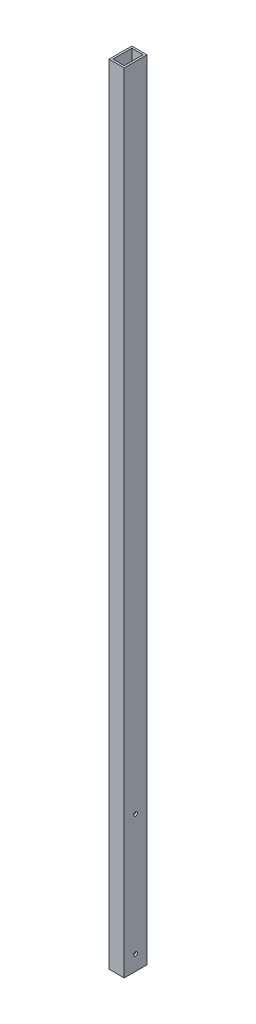
ISO-10303-21;
HEADER;
FILE_DESCRIPTION(('STEP AP214'),'2;1');
FILE_NAME('part.step','',(''),(''),'','','');
FILE_SCHEMA(('AUTOMOTIVE_DESIGN { 1 0 10303 214 1 1 1 1 }'));
ENDSEC;
DATA;
#1=APPLICATION_CONTEXT('core data for automotive mechanical design processes');
#2=APPLICATION_PROTOCOL_DEFINITION('international standard','automotive_design',2000,#1);
#3=PRODUCT_CONTEXT('',#1,'mechanical');
#4=PRODUCT('Part','Part','',(#3));
#5=PRODUCT_RELATED_PRODUCT_CATEGORY('part','',(#4));
#6=PRODUCT_DEFINITION_FORMATION('','',#4);
#7=PRODUCT_DEFINITION_CONTEXT('part definition',#1,'design');
#8=PRODUCT_DEFINITION('design','',#6,#7);
#9=PRODUCT_DEFINITION_SHAPE('','',#8);
#10=(LENGTH_UNIT() NAMED_UNIT(*) SI_UNIT(.MILLI.,.METRE.));
#11=(NAMED_UNIT(*) PLANE_ANGLE_UNIT() SI_UNIT($,.RADIAN.));
#12=(NAMED_UNIT(*) SI_UNIT($,.STERADIAN.) SOLID_ANGLE_UNIT());
#13=UNCERTAINTY_MEASURE_WITH_UNIT(LENGTH_MEASURE(1.E-05),#10,'distance_accuracy_value','');
#14=(GEOMETRIC_REPRESENTATION_CONTEXT(3) GLOBAL_UNCERTAINTY_ASSIGNED_CONTEXT((#13)) GLOBAL_UNIT_ASSIGNED_CONTEXT((#10,
#11,#12)) REPRESENTATION_CONTEXT('',''));
#15=CARTESIAN_POINT('',(0.,0.,0.));
#16=DIRECTION('',(0.,0.,1.));
#17=DIRECTION('',(1.,0.,0.));
#18=AXIS2_PLACEMENT_3D('',#15,#16,#17);
#19=CARTESIAN_POINT('',(0.,1320.8,0.));
#20=DIRECTION('',(0.,-1.,0.));
#21=DIRECTION('',(0.,0.,-1.));
#22=AXIS2_PLACEMENT_3D('',#19,#20,#21);
#23=PLANE('',#22);
#24=DIRECTION('',(0.,0.,-1.));
#25=VECTOR('',#24,1.);
#26=CARTESIAN_POINT('',(12.6999999999998,1320.8,19.0500000000001));
#27=LINE('',#26,#25);
#28=CARTESIAN_POINT('',(12.6999999999998,1320.8,19.0500000000001));
#29=VERTEX_POINT('',#28);
#30=CARTESIAN_POINT('',(12.6999999999998,1320.8,-19.0499999999999));
#31=VERTEX_POINT('',#30);
#32=EDGE_CURVE('E144',#29,#31,#27,.T.);
#33=ORIENTED_EDGE('',*,*,#32,.T.);
#34=DIRECTION('',(-1.,0.,0.));
#35=VECTOR('',#34,1.);
#36=CARTESIAN_POINT('',(-12.7000000000003,1320.8,-19.0499999999999));
#37=LINE('',#36,#35);
#38=CARTESIAN_POINT('',(-12.7000000000003,1320.8,-19.0499999999999));
#39=VERTEX_POINT('',#38);
#40=EDGE_CURVE('E147',#31,#39,#37,.T.);
#41=ORIENTED_EDGE('',*,*,#40,.T.);
#42=DIRECTION('',(0.,0.,1.));
#43=VECTOR('',#42,1.);
#44=CARTESIAN_POINT('',(-12.7000000000003,1320.8,19.0500000000001));
#45=LINE('',#44,#43);
#46=CARTESIAN_POINT('',(-12.7000000000003,1320.8,19.0500000000001));
#47=VERTEX_POINT('',#46);
#48=EDGE_CURVE('E150',#39,#47,#45,.T.);
#49=ORIENTED_EDGE('',*,*,#48,.T.);
#50=DIRECTION('',(1.,0.,0.));
#51=VECTOR('',#50,1.);
#52=CARTESIAN_POINT('',(-12.7000000000003,1320.8,19.0500000000001));
#53=LINE('',#52,#51);
#54=EDGE_CURVE('E152',#47,#29,#53,.T.);
#55=ORIENTED_EDGE('',*,*,#54,.T.);
#56=EDGE_LOOP('',(#33,#41,#49,#55));
#57=FACE_BOUND('',#56,.T.);
#58=DIRECTION('',(0.,0.,-1.));
#59=VECTOR('',#58,1.);
#60=CARTESIAN_POINT('',(9.52499999999974,1320.8,15.8750000000001));
#61=LINE('',#60,#59);
#62=CARTESIAN_POINT('',(9.52499999999974,1320.8,15.8750000000001));
#63=VERTEX_POINT('',#62);
#64=CARTESIAN_POINT('',(9.52499999999974,1320.8,-15.8749999999999));
#65=VERTEX_POINT('',#64);
#66=EDGE_CURVE('E106',#63,#65,#61,.T.);
#67=ORIENTED_EDGE('',*,*,#66,.F.);
#68=DIRECTION('',(1.,0.,0.));
#69=VECTOR('',#68,1.);
#70=CARTESIAN_POINT('',(-9.52500000000027,1320.8,15.8750000000001));
#71=LINE('',#70,#69);
#72=CARTESIAN_POINT('',(-9.52500000000027,1320.8,15.8750000000001));
#73=VERTEX_POINT('',#72);
#74=EDGE_CURVE('E128',#73,#63,#71,.T.);
#75=ORIENTED_EDGE('',*,*,#74,.F.);
#76=DIRECTION('',(0.,0.,1.));
#77=VECTOR('',#76,1.);
#78=CARTESIAN_POINT('',(-9.52500000000027,1320.8,15.8750000000001));
#79=LINE('',#78,#77);
#80=CARTESIAN_POINT('',(-9.52500000000027,1320.8,-15.8749999999999));
#81=VERTEX_POINT('',#80);
#82=EDGE_CURVE('E126',#81,#73,#79,.T.);
#83=ORIENTED_EDGE('',*,*,#82,.F.);
#84=DIRECTION('',(-1.,0.,0.));
#85=VECTOR('',#84,1.);
#86=CARTESIAN_POINT('',(-9.52500000000027,1320.8,-15.8749999999999));
#87=LINE('',#86,#85);
#88=EDGE_CURVE('E114',#65,#81,#87,.T.);
#89=ORIENTED_EDGE('',*,*,#88,.F.);
#90=EDGE_LOOP('',(#67,#75,#83,#89));
#91=FACE_BOUND('',#90,.T.);
#92=ADVANCED_FACE('F41',(#57,#91),#23,.F.);
#93=CARTESIAN_POINT('',(0.,0.,0.));
#94=DIRECTION('',(0.,-1.,0.));
#95=DIRECTION('',(0.,0.,-1.));
#96=AXIS2_PLACEMENT_3D('',#93,#94,#95);
#97=PLANE('',#96);
#98=DIRECTION('',(0.,0.,-1.));
#99=VECTOR('',#98,1.);
#100=CARTESIAN_POINT('',(12.6999999999998,0.,19.0500000000001));
#101=LINE('',#100,#99);
#102=CARTESIAN_POINT('',(12.6999999999998,0.,19.0500000000001));
#103=VERTEX_POINT('',#102);
#104=CARTESIAN_POINT('',(12.6999999999998,0.,-19.0499999999999));
#105=VERTEX_POINT('',#104);
#106=EDGE_CURVE('E122',#103,#105,#101,.T.);
#107=ORIENTED_EDGE('',*,*,#106,.F.);
#108=DIRECTION('',(1.,0.,0.));
#109=VECTOR('',#108,1.);
#110=CARTESIAN_POINT('',(-12.7000000000003,0.,19.0500000000001));
#111=LINE('',#110,#109);
#112=CARTESIAN_POINT('',(-12.7000000000003,0.,19.0500000000001));
#113=VERTEX_POINT('',#112);
#114=EDGE_CURVE('E148',#113,#103,#111,.T.);
#115=ORIENTED_EDGE('',*,*,#114,.F.);
#116=DIRECTION('',(0.,0.,1.));
#117=VECTOR('',#116,1.);
#118=CARTESIAN_POINT('',(-12.7000000000003,0.,19.0500000000001));
#119=LINE('',#118,#117);
#120=CARTESIAN_POINT('',(-12.7000000000003,0.,-19.0499999999999));
#121=VERTEX_POINT('',#120);
#122=EDGE_CURVE('E159',#121,#113,#119,.T.);
#123=ORIENTED_EDGE('',*,*,#122,.F.);
#124=DIRECTION('',(-1.,0.,0.));
#125=VECTOR('',#124,1.);
#126=CARTESIAN_POINT('',(-12.7000000000003,0.,-19.0499999999999));
#127=LINE('',#126,#125);
#128=EDGE_CURVE('E157',#105,#121,#127,.T.);
#129=ORIENTED_EDGE('',*,*,#128,.F.);
#130=EDGE_LOOP('',(#107,#115,#123,#129));
#131=FACE_BOUND('',#130,.T.);
#132=DIRECTION('',(1.,0.,0.));
#133=VECTOR('',#132,1.);
#134=CARTESIAN_POINT('',(-9.52500000000027,0.,15.8750000000001));
#135=LINE('',#134,#133);
#136=CARTESIAN_POINT('',(-9.52500000000027,0.,15.8750000000001));
#137=VERTEX_POINT('',#136);
#138=CARTESIAN_POINT('',(9.52499999999974,0.,15.8750000000001));
#139=VERTEX_POINT('',#138);
#140=EDGE_CURVE('E115',#137,#139,#135,.T.);
#141=ORIENTED_EDGE('',*,*,#140,.T.);
#142=DIRECTION('',(0.,0.,-1.));
#143=VECTOR('',#142,1.);
#144=CARTESIAN_POINT('',(9.52499999999974,0.,15.8750000000001));
#145=LINE('',#144,#143);
#146=CARTESIAN_POINT('',(9.52499999999974,0.,-15.8749999999999));
#147=VERTEX_POINT('',#146);
#148=EDGE_CURVE('E64',#139,#147,#145,.T.);
#149=ORIENTED_EDGE('',*,*,#148,.T.);
#150=DIRECTION('',(-1.,0.,0.));
#151=VECTOR('',#150,1.);
#152=CARTESIAN_POINT('',(-9.52500000000027,0.,-15.8749999999999));
#153=LINE('',#152,#151);
#154=CARTESIAN_POINT('',(-9.52500000000027,0.,-15.8749999999999));
#155=VERTEX_POINT('',#154);
#156=EDGE_CURVE('E121',#147,#155,#153,.T.);
#157=ORIENTED_EDGE('',*,*,#156,.T.);
#158=DIRECTION('',(0.,0.,1.));
#159=VECTOR('',#158,1.);
#160=CARTESIAN_POINT('',(-9.52500000000027,0.,15.8750000000001));
#161=LINE('',#160,#159);
#162=EDGE_CURVE('E136',#155,#137,#161,.T.);
#163=ORIENTED_EDGE('',*,*,#162,.T.);
#164=EDGE_LOOP('',(#141,#149,#157,#163));
#165=FACE_BOUND('',#164,.T.);
#166=ADVANCED_FACE('F177',(#131,#165),#97,.T.);
#167=CARTESIAN_POINT('',(12.6999999999998,1320.8,19.0500000000001));
#168=DIRECTION('',(-1.,0.,0.));
#169=DIRECTION('',(0.,0.,1.));
#170=AXIS2_PLACEMENT_3D('',#167,#168,#169);
#171=PLANE('',#170);
#172=CARTESIAN_POINT('',(12.7000000000003,228.6,0.));
#173=DIRECTION('',(-1.,0.,0.));
#174=DIRECTION('',(0.,0.,1.));
#175=AXIS2_PLACEMENT_3D('',#172,#173,#174);
#176=CIRCLE('',#175,3.175);
#177=CARTESIAN_POINT('',(12.7000000000003,228.6,3.175));
#178=VERTEX_POINT('',#177);
#179=EDGE_CURVE('E232',#178,#178,#176,.T.);
#180=ORIENTED_EDGE('',*,*,#179,.T.);
#181=EDGE_LOOP('',(#180));
#182=FACE_BOUND('',#181,.T.);
#183=CARTESIAN_POINT('',(12.7000000000003,25.4,0.));
#184=DIRECTION('',(-1.,0.,0.));
#185=DIRECTION('',(0.,0.,1.));
#186=AXIS2_PLACEMENT_3D('',#183,#184,#185);
#187=CIRCLE('',#186,3.175);
#188=CARTESIAN_POINT('',(12.7000000000003,25.4,3.175));
#189=VERTEX_POINT('',#188);
#190=EDGE_CURVE('E224',#189,#189,#187,.T.);
#191=ORIENTED_EDGE('',*,*,#190,.T.);
#192=EDGE_LOOP('',(#191));
#193=FACE_BOUND('',#192,.T.);
#194=ORIENTED_EDGE('',*,*,#106,.T.);
#195=DIRECTION('',(0.,-1.,0.));
#196=VECTOR('',#195,1.);
#197=CARTESIAN_POINT('',(12.6999999999998,1320.8,-19.0499999999999));
#198=LINE('',#197,#196);
#199=EDGE_CURVE('E11',#31,#105,#198,.T.);
#200=ORIENTED_EDGE('',*,*,#199,.F.);
#201=ORIENTED_EDGE('',*,*,#32,.F.);
#202=DIRECTION('',(0.,-1.,0.));
#203=VECTOR('',#202,1.);
#204=CARTESIAN_POINT('',(12.6999999999998,1320.8,19.0500000000001));
#205=LINE('',#204,#203);
#206=EDGE_CURVE('E154',#29,#103,#205,.T.);
#207=ORIENTED_EDGE('',*,*,#206,.T.);
#208=EDGE_LOOP('',(#194,#200,#201,#207));
#209=FACE_BOUND('',#208,.T.);
#210=ADVANCED_FACE('F43',(#182,#193,#209),#171,.F.);
#211=CARTESIAN_POINT('',(-12.7000000000003,1320.8,-19.0499999999999));
#212=DIRECTION('',(0.,0.,1.));
#213=DIRECTION('',(1.,0.,0.));
#214=AXIS2_PLACEMENT_3D('',#211,#212,#213);
#215=PLANE('',#214);
#216=ORIENTED_EDGE('',*,*,#128,.T.);
#217=DIRECTION('',(0.,-1.,0.));
#218=VECTOR('',#217,1.);
#219=CARTESIAN_POINT('',(-12.7000000000003,1320.8,-19.0499999999999));
#220=LINE('',#219,#218);
#221=EDGE_CURVE('E49',#39,#121,#220,.T.);
#222=ORIENTED_EDGE('',*,*,#221,.F.);
#223=ORIENTED_EDGE('',*,*,#40,.F.);
#224=ORIENTED_EDGE('',*,*,#199,.T.);
#225=EDGE_LOOP('',(#216,#222,#223,#224));
#226=FACE_BOUND('',#225,.T.);
#227=ADVANCED_FACE('F187',(#226),#215,.F.);
#228=CARTESIAN_POINT('',(-12.7000000000003,1320.8,19.0500000000001));
#229=DIRECTION('',(1.,0.,0.));
#230=DIRECTION('',(0.,0.,-1.));
#231=AXIS2_PLACEMENT_3D('',#228,#229,#230);
#232=PLANE('',#231);
#233=CARTESIAN_POINT('',(-12.7000000000003,228.6,0.));
#234=DIRECTION('',(-1.,0.,0.));
#235=DIRECTION('',(0.,0.,1.));
#236=AXIS2_PLACEMENT_3D('',#233,#234,#235);
#237=CIRCLE('',#236,3.175);
#238=CARTESIAN_POINT('',(-12.7000000000003,228.6,3.175));
#239=VERTEX_POINT('',#238);
#240=EDGE_CURVE('E223',#239,#239,#237,.T.);
#241=ORIENTED_EDGE('',*,*,#240,.F.);
#242=EDGE_LOOP('',(#241));
#243=FACE_BOUND('',#242,.T.);
#244=CARTESIAN_POINT('',(-12.7000000000003,25.4,0.));
#245=DIRECTION('',(-1.,0.,0.));
#246=DIRECTION('',(0.,0.,1.));
#247=AXIS2_PLACEMENT_3D('',#244,#245,#246);
#248=CIRCLE('',#247,3.175);
#249=CARTESIAN_POINT('',(-12.7000000000003,25.4,3.175));
#250=VERTEX_POINT('',#249);
#251=EDGE_CURVE('E236',#250,#250,#248,.T.);
#252=ORIENTED_EDGE('',*,*,#251,.F.);
#253=EDGE_LOOP('',(#252));
#254=FACE_BOUND('',#253,.T.);
#255=ORIENTED_EDGE('',*,*,#122,.T.);
#256=DIRECTION('',(0.,-1.,0.));
#257=VECTOR('',#256,1.);
#258=CARTESIAN_POINT('',(-12.7000000000003,1320.8,19.0500000000001));
#259=LINE('',#258,#257);
#260=EDGE_CURVE('E164',#47,#113,#259,.T.);
#261=ORIENTED_EDGE('',*,*,#260,.F.);
#262=ORIENTED_EDGE('',*,*,#48,.F.);
#263=ORIENTED_EDGE('',*,*,#221,.T.);
#264=EDGE_LOOP('',(#255,#261,#262,#263));
#265=FACE_BOUND('',#264,.T.);
#266=ADVANCED_FACE('F171',(#243,#254,#265),#232,.F.);
#267=CARTESIAN_POINT('',(-12.7000000000003,1320.8,19.0500000000001));
#268=DIRECTION('',(0.,0.,-1.));
#269=DIRECTION('',(-1.,0.,0.));
#270=AXIS2_PLACEMENT_3D('',#267,#268,#269);
#271=PLANE('',#270);
#272=ORIENTED_EDGE('',*,*,#114,.T.);
#273=ORIENTED_EDGE('',*,*,#206,.F.);
#274=ORIENTED_EDGE('',*,*,#54,.F.);
#275=ORIENTED_EDGE('',*,*,#260,.T.);
#276=EDGE_LOOP('',(#272,#273,#274,#275));
#277=FACE_BOUND('',#276,.T.);
#278=ADVANCED_FACE('F181',(#277),#271,.F.);
#279=CARTESIAN_POINT('',(9.52499999999974,1320.8,15.8750000000001));
#280=DIRECTION('',(-1.,0.,0.));
#281=DIRECTION('',(0.,0.,1.));
#282=AXIS2_PLACEMENT_3D('',#279,#280,#281);
#283=PLANE('',#282);
#284=CARTESIAN_POINT('',(9.52500000000027,228.6,0.));
#285=DIRECTION('',(-1.,0.,0.));
#286=DIRECTION('',(0.,0.,1.));
#287=AXIS2_PLACEMENT_3D('',#284,#285,#286);
#288=CIRCLE('',#287,3.175);
#289=CARTESIAN_POINT('',(9.52500000000027,228.6,3.175));
#290=VERTEX_POINT('',#289);
#291=EDGE_CURVE('E218',#290,#290,#288,.T.);
#292=ORIENTED_EDGE('',*,*,#291,.F.);
#293=EDGE_LOOP('',(#292));
#294=FACE_BOUND('',#293,.T.);
#295=CARTESIAN_POINT('',(9.52500000000027,25.4,0.));
#296=DIRECTION('',(-1.,0.,0.));
#297=DIRECTION('',(0.,0.,1.));
#298=AXIS2_PLACEMENT_3D('',#295,#296,#297);
#299=CIRCLE('',#298,3.175);
#300=CARTESIAN_POINT('',(9.52500000000027,25.4,3.175));
#301=VERTEX_POINT('',#300);
#302=EDGE_CURVE('E221',#301,#301,#299,.T.);
#303=ORIENTED_EDGE('',*,*,#302,.F.);
#304=EDGE_LOOP('',(#303));
#305=FACE_BOUND('',#304,.T.);
#306=ORIENTED_EDGE('',*,*,#148,.F.);
#307=DIRECTION('',(0.,-1.,0.));
#308=VECTOR('',#307,1.);
#309=CARTESIAN_POINT('',(9.52499999999974,1320.8,15.8750000000001));
#310=LINE('',#309,#308);
#311=EDGE_CURVE('E110',#63,#139,#310,.T.);
#312=ORIENTED_EDGE('',*,*,#311,.F.);
#313=ORIENTED_EDGE('',*,*,#66,.T.);
#314=DIRECTION('',(0.,-1.,0.));
#315=VECTOR('',#314,1.);
#316=CARTESIAN_POINT('',(9.52499999999974,1320.8,-15.8749999999999));
#317=LINE('',#316,#315);
#318=EDGE_CURVE('E109',#65,#147,#317,.T.);
#319=ORIENTED_EDGE('',*,*,#318,.T.);
#320=EDGE_LOOP('',(#306,#312,#313,#319));
#321=FACE_BOUND('',#320,.T.);
#322=ADVANCED_FACE('F108',(#294,#305,#321),#283,.T.);
#323=CARTESIAN_POINT('',(-9.52500000000027,1320.8,-15.8749999999999));
#324=DIRECTION('',(0.,0.,1.));
#325=DIRECTION('',(1.,0.,0.));
#326=AXIS2_PLACEMENT_3D('',#323,#324,#325);
#327=PLANE('',#326);
#328=ORIENTED_EDGE('',*,*,#156,.F.);
#329=ORIENTED_EDGE('',*,*,#318,.F.);
#330=ORIENTED_EDGE('',*,*,#88,.T.);
#331=DIRECTION('',(0.,-1.,0.));
#332=VECTOR('',#331,1.);
#333=CARTESIAN_POINT('',(-9.52500000000027,1320.8,-15.8749999999999));
#334=LINE('',#333,#332);
#335=EDGE_CURVE('E123',#81,#155,#334,.T.);
#336=ORIENTED_EDGE('',*,*,#335,.T.);
#337=EDGE_LOOP('',(#328,#329,#330,#336));
#338=FACE_BOUND('',#337,.T.);
#339=ADVANCED_FACE('F118',(#338),#327,.T.);
#340=CARTESIAN_POINT('',(-9.52500000000027,1320.8,15.8750000000001));
#341=DIRECTION('',(1.,0.,0.));
#342=DIRECTION('',(0.,0.,-1.));
#343=AXIS2_PLACEMENT_3D('',#340,#341,#342);
#344=PLANE('',#343);
#345=CARTESIAN_POINT('',(-9.52500000000027,228.6,0.));
#346=DIRECTION('',(-1.,0.,0.));
#347=DIRECTION('',(0.,0.,1.));
#348=AXIS2_PLACEMENT_3D('',#345,#346,#347);
#349=CIRCLE('',#348,3.175);
#350=CARTESIAN_POINT('',(-9.52500000000027,228.6,3.175));
#351=VERTEX_POINT('',#350);
#352=EDGE_CURVE('E227',#351,#351,#349,.T.);
#353=ORIENTED_EDGE('',*,*,#352,.T.);
#354=EDGE_LOOP('',(#353));
#355=FACE_BOUND('',#354,.T.);
#356=CARTESIAN_POINT('',(-9.52500000000027,25.4,0.));
#357=DIRECTION('',(-1.,0.,0.));
#358=DIRECTION('',(0.,0.,1.));
#359=AXIS2_PLACEMENT_3D('',#356,#357,#358);
#360=CIRCLE('',#359,3.175);
#361=CARTESIAN_POINT('',(-9.52500000000027,25.4,3.175));
#362=VERTEX_POINT('',#361);
#363=EDGE_CURVE('E134',#362,#362,#360,.T.);
#364=ORIENTED_EDGE('',*,*,#363,.T.);
#365=EDGE_LOOP('',(#364));
#366=FACE_BOUND('',#365,.T.);
#367=ORIENTED_EDGE('',*,*,#162,.F.);
#368=ORIENTED_EDGE('',*,*,#335,.F.);
#369=ORIENTED_EDGE('',*,*,#82,.T.);
#370=DIRECTION('',(0.,-1.,0.));
#371=VECTOR('',#370,1.);
#372=CARTESIAN_POINT('',(-9.52500000000027,1320.8,15.8750000000001));
#373=LINE('',#372,#371);
#374=EDGE_CURVE('E56',#73,#137,#373,.T.);
#375=ORIENTED_EDGE('',*,*,#374,.T.);
#376=EDGE_LOOP('',(#367,#368,#369,#375));
#377=FACE_BOUND('',#376,.T.);
#378=ADVANCED_FACE('F214',(#355,#366,#377),#344,.T.);
#379=CARTESIAN_POINT('',(-9.52500000000027,1320.8,15.8750000000001));
#380=DIRECTION('',(0.,0.,-1.));
#381=DIRECTION('',(-1.,0.,0.));
#382=AXIS2_PLACEMENT_3D('',#379,#380,#381);
#383=PLANE('',#382);
#384=ORIENTED_EDGE('',*,*,#140,.F.);
#385=ORIENTED_EDGE('',*,*,#374,.F.);
#386=ORIENTED_EDGE('',*,*,#74,.T.);
#387=ORIENTED_EDGE('',*,*,#311,.T.);
#388=EDGE_LOOP('',(#384,#385,#386,#387));
#389=FACE_BOUND('',#388,.T.);
#390=ADVANCED_FACE('F246',(#389),#383,.T.);
#391=CARTESIAN_POINT('',(-9.52500000000027,25.4,0.));
#392=DIRECTION('',(-1.,0.,0.));
#393=DIRECTION('',(0.,0.,1.));
#394=AXIS2_PLACEMENT_3D('',#391,#392,#393);
#395=CYLINDRICAL_SURFACE('',#394,3.175);
#396=ORIENTED_EDGE('',*,*,#363,.F.);
#397=EDGE_LOOP('',(#396));
#398=FACE_BOUND('',#397,.T.);
#399=ORIENTED_EDGE('',*,*,#251,.T.);
#400=EDGE_LOOP('',(#399));
#401=FACE_BOUND('',#400,.T.);
#402=ADVANCED_FACE('F242',(#398,#401),#395,.F.);
#403=CARTESIAN_POINT('',(-9.52500000000027,228.6,0.));
#404=DIRECTION('',(-1.,0.,0.));
#405=DIRECTION('',(0.,0.,1.));
#406=AXIS2_PLACEMENT_3D('',#403,#404,#405);
#407=CYLINDRICAL_SURFACE('',#406,3.175);
#408=ORIENTED_EDGE('',*,*,#352,.F.);
#409=EDGE_LOOP('',(#408));
#410=FACE_BOUND('',#409,.T.);
#411=ORIENTED_EDGE('',*,*,#240,.T.);
#412=EDGE_LOOP('',(#411));
#413=FACE_BOUND('',#412,.T.);
#414=ADVANCED_FACE('F245',(#410,#413),#407,.F.);
#415=CARTESIAN_POINT('',(9.52500000000027,25.4,0.));
#416=DIRECTION('',(1.,0.,0.));
#417=DIRECTION('',(0.,0.,-1.));
#418=AXIS2_PLACEMENT_3D('',#415,#416,#417);
#419=CYLINDRICAL_SURFACE('',#418,3.175);
#420=ORIENTED_EDGE('',*,*,#302,.T.);
#421=EDGE_LOOP('',(#420));
#422=FACE_BOUND('',#421,.T.);
#423=ORIENTED_EDGE('',*,*,#190,.F.);
#424=EDGE_LOOP('',(#423));
#425=FACE_BOUND('',#424,.T.);
#426=ADVANCED_FACE('F253',(#422,#425),#419,.F.);
#427=CARTESIAN_POINT('',(9.52500000000027,228.6,0.));
#428=DIRECTION('',(1.,0.,0.));
#429=DIRECTION('',(0.,0.,-1.));
#430=AXIS2_PLACEMENT_3D('',#427,#428,#429);
#431=CYLINDRICAL_SURFACE('',#430,3.175);
#432=ORIENTED_EDGE('',*,*,#291,.T.);
#433=EDGE_LOOP('',(#432));
#434=FACE_BOUND('',#433,.T.);
#435=ORIENTED_EDGE('',*,*,#179,.F.);
#436=EDGE_LOOP('',(#435));
#437=FACE_BOUND('',#436,.T.);
#438=ADVANCED_FACE('F298',(#434,#437),#431,.F.);
#439=CLOSED_SHELL('',(#92,#166,#210,#227,#266,#278,#322,#339,#378,#390,#402,#414,#426,#438));
#440=MANIFOLD_SOLID_BREP('B2',#439);
#441=ADVANCED_BREP_SHAPE_REPRESENTATION('',(#18,#440),#14);
#442=SHAPE_DEFINITION_REPRESENTATION(#9,#441);
ENDSEC;
END-ISO-10303-21;
